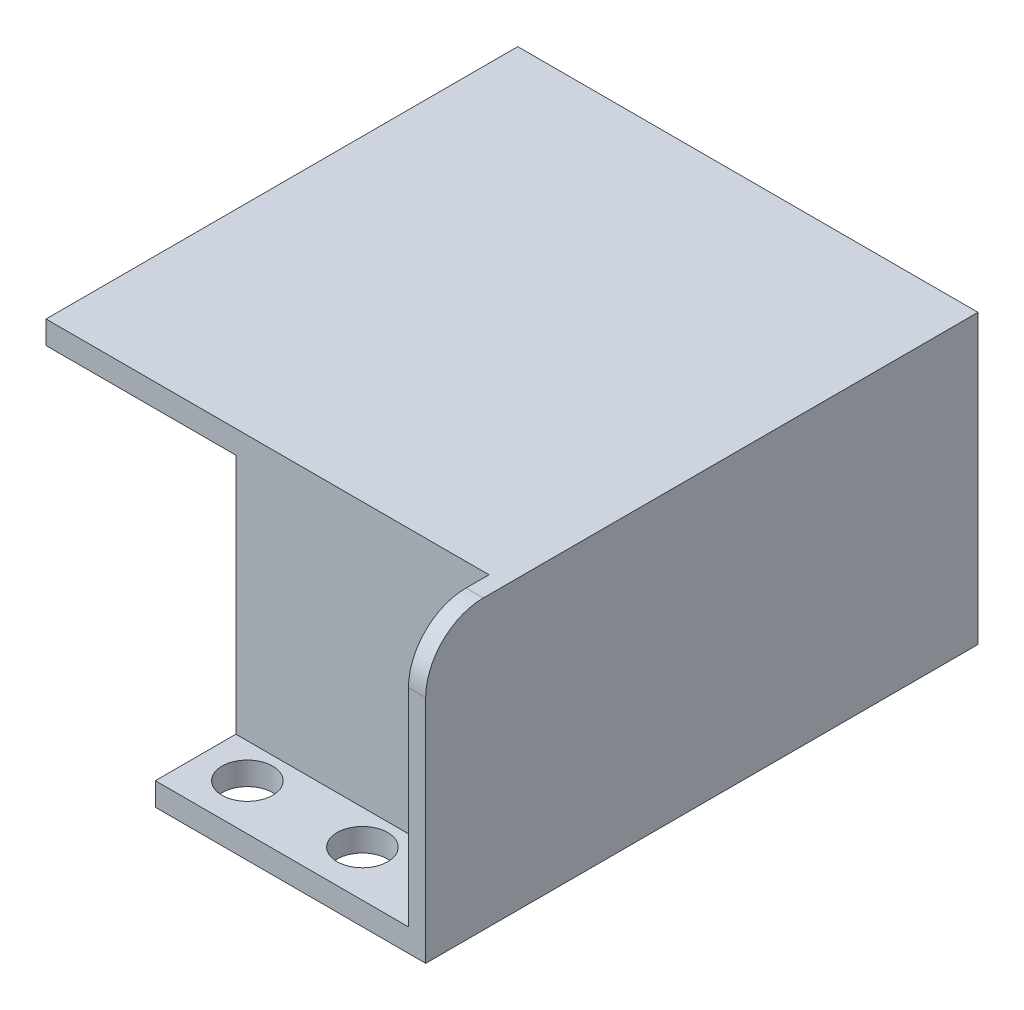
ISO-10303-21;
HEADER;
FILE_DESCRIPTION(('STEP AP214'),'2;1');
FILE_NAME('part.step','',(''),(''),'','','');
FILE_SCHEMA(('AUTOMOTIVE_DESIGN { 1 0 10303 214 1 1 1 1 }'));
ENDSEC;
DATA;
#1=APPLICATION_CONTEXT('core data for automotive mechanical design processes');
#2=APPLICATION_PROTOCOL_DEFINITION('international standard','automotive_design',2000,#1);
#3=PRODUCT_CONTEXT('',#1,'mechanical');
#4=PRODUCT('Part','Part','',(#3));
#5=PRODUCT_RELATED_PRODUCT_CATEGORY('part','',(#4));
#6=PRODUCT_DEFINITION_FORMATION('','',#4);
#7=PRODUCT_DEFINITION_CONTEXT('part definition',#1,'design');
#8=PRODUCT_DEFINITION('design','',#6,#7);
#9=PRODUCT_DEFINITION_SHAPE('','',#8);
#10=(LENGTH_UNIT() NAMED_UNIT(*) SI_UNIT(.MILLI.,.METRE.));
#11=(NAMED_UNIT(*) PLANE_ANGLE_UNIT() SI_UNIT($,.RADIAN.));
#12=(NAMED_UNIT(*) SI_UNIT($,.STERADIAN.) SOLID_ANGLE_UNIT());
#13=UNCERTAINTY_MEASURE_WITH_UNIT(LENGTH_MEASURE(1.E-05),#10,'distance_accuracy_value','');
#14=(GEOMETRIC_REPRESENTATION_CONTEXT(3) GLOBAL_UNCERTAINTY_ASSIGNED_CONTEXT((#13)) GLOBAL_UNIT_ASSIGNED_CONTEXT((#10,
#11,#12)) REPRESENTATION_CONTEXT('',''));
#15=CARTESIAN_POINT('',(0.,0.,0.));
#16=DIRECTION('',(0.,0.,1.));
#17=DIRECTION('',(1.,0.,0.));
#18=AXIS2_PLACEMENT_3D('',#15,#16,#17);
#19=CARTESIAN_POINT('',(22.,-23.,8.));
#20=DIRECTION('',(0.,0.,-1.));
#21=DIRECTION('',(-1.,0.,0.));
#22=AXIS2_PLACEMENT_3D('',#19,#20,#21);
#23=PLANE('',#22);
#24=DIRECTION('',(0.,-1.,0.));
#25=VECTOR('',#24,1.);
#26=CARTESIAN_POINT('',(23.5,-25.,8.));
#27=LINE('',#26,#25);
#28=CARTESIAN_POINT('',(23.5,-5.,8.));
#29=VERTEX_POINT('',#28);
#30=CARTESIAN_POINT('',(23.5,-25.,8.));
#31=VERTEX_POINT('',#30);
#32=EDGE_CURVE('E166',#29,#31,#27,.T.);
#33=ORIENTED_EDGE('',*,*,#32,.F.);
#34=DIRECTION('',(-1.,0.,0.));
#35=VECTOR('',#34,1.);
#36=CARTESIAN_POINT('',(22.,-5.,8.));
#37=LINE('',#36,#35);
#38=CARTESIAN_POINT('',(22.,-5.,8.));
#39=VERTEX_POINT('',#38);
#40=EDGE_CURVE('E186',#29,#39,#37,.T.);
#41=ORIENTED_EDGE('',*,*,#40,.T.);
#42=DIRECTION('',(0.,-1.,0.));
#43=VECTOR('',#42,1.);
#44=CARTESIAN_POINT('',(22.,-25.,8.));
#45=LINE('',#44,#43);
#46=CARTESIAN_POINT('',(22.,-23.,8.));
#47=VERTEX_POINT('',#46);
#48=EDGE_CURVE('E165',#39,#47,#45,.T.);
#49=ORIENTED_EDGE('',*,*,#48,.T.);
#50=DIRECTION('',(-1.,0.,0.));
#51=VECTOR('',#50,1.);
#52=CARTESIAN_POINT('',(22.,-23.,8.));
#53=LINE('',#52,#51);
#54=CARTESIAN_POINT('',(0.,-23.,8.));
#55=VERTEX_POINT('',#54);
#56=EDGE_CURVE('E206',#47,#55,#53,.T.);
#57=ORIENTED_EDGE('',*,*,#56,.T.);
#58=DIRECTION('',(0.,-1.,0.));
#59=VECTOR('',#58,1.);
#60=CARTESIAN_POINT('',(0.,-23.,8.));
#61=LINE('',#60,#59);
#62=CARTESIAN_POINT('',(0.,-25.,8.));
#63=VERTEX_POINT('',#62);
#64=EDGE_CURVE('E222',#55,#63,#61,.T.);
#65=ORIENTED_EDGE('',*,*,#64,.T.);
#66=DIRECTION('',(-1.,0.,0.));
#67=VECTOR('',#66,1.);
#68=CARTESIAN_POINT('',(22.,-25.,8.));
#69=LINE('',#68,#67);
#70=EDGE_CURVE('E189',#31,#63,#69,.T.);
#71=ORIENTED_EDGE('',*,*,#70,.F.);
#72=EDGE_LOOP('',(#33,#41,#49,#57,#65,#71));
#73=FACE_BOUND('',#72,.T.);
#74=ADVANCED_FACE('F35',(#73),#23,.F.);
#75=CARTESIAN_POINT('',(22.,-25.,8.));
#76=DIRECTION('',(0.,1.,0.));
#77=DIRECTION('',(0.,0.,1.));
#78=AXIS2_PLACEMENT_3D('',#75,#76,#77);
#79=PLANE('',#78);
#80=CARTESIAN_POINT('',(4.,-25.,4.));
#81=DIRECTION('',(0.,-1.,0.));
#82=DIRECTION('',(0.,0.,-1.));
#83=AXIS2_PLACEMENT_3D('',#80,#81,#82);
#84=CIRCLE('',#83,2.2);
#85=CARTESIAN_POINT('',(4.,-25.,1.8));
#86=VERTEX_POINT('',#85);
#87=EDGE_CURVE('E326',#86,#86,#84,.T.);
#88=ORIENTED_EDGE('',*,*,#87,.F.);
#89=EDGE_LOOP('',(#88));
#90=FACE_BOUND('',#89,.T.);
#91=CARTESIAN_POINT('',(14.,-25.,4.));
#92=DIRECTION('',(0.,-1.,0.));
#93=DIRECTION('',(0.,0.,-1.));
#94=AXIS2_PLACEMENT_3D('',#91,#92,#93);
#95=CIRCLE('',#94,2.2);
#96=CARTESIAN_POINT('',(14.,-25.,1.8));
#97=VERTEX_POINT('',#96);
#98=EDGE_CURVE('E317',#97,#97,#95,.T.);
#99=ORIENTED_EDGE('',*,*,#98,.F.);
#100=EDGE_LOOP('',(#99));
#101=FACE_BOUND('',#100,.T.);
#102=DIRECTION('',(0.,0.,-1.));
#103=VECTOR('',#102,1.);
#104=CARTESIAN_POINT('',(0.,-25.,8.));
#105=LINE('',#104,#103);
#106=CARTESIAN_POINT('',(0.,-25.,0.));
#107=VERTEX_POINT('',#106);
#108=EDGE_CURVE('E224',#63,#107,#105,.T.);
#109=ORIENTED_EDGE('',*,*,#108,.T.);
#110=DIRECTION('',(-1.,0.,0.));
#111=VECTOR('',#110,1.);
#112=CARTESIAN_POINT('',(22.,-25.,0.));
#113=LINE('',#112,#111);
#114=CARTESIAN_POINT('',(22.,-25.,0.));
#115=VERTEX_POINT('',#114);
#116=EDGE_CURVE('E194',#115,#107,#113,.T.);
#117=ORIENTED_EDGE('',*,*,#116,.F.);
#118=DIRECTION('',(0.,0.,-1.));
#119=VECTOR('',#118,1.);
#120=CARTESIAN_POINT('',(22.,-25.,8.));
#121=LINE('',#120,#119);
#122=CARTESIAN_POINT('',(22.,-25.,-40.));
#123=VERTEX_POINT('',#122);
#124=EDGE_CURVE('E183',#115,#123,#121,.T.);
#125=ORIENTED_EDGE('',*,*,#124,.T.);
#126=DIRECTION('',(-1.,0.,0.));
#127=VECTOR('',#126,1.);
#128=CARTESIAN_POINT('',(23.5,-25.,-40.));
#129=LINE('',#128,#127);
#130=CARTESIAN_POINT('',(23.5,-25.,-40.));
#131=VERTEX_POINT('',#130);
#132=EDGE_CURVE('E225',#131,#123,#129,.T.);
#133=ORIENTED_EDGE('',*,*,#132,.F.);
#134=DIRECTION('',(0.,0.,-1.));
#135=VECTOR('',#134,1.);
#136=CARTESIAN_POINT('',(23.5,-25.,8.));
#137=LINE('',#136,#135);
#138=EDGE_CURVE('E168',#31,#131,#137,.T.);
#139=ORIENTED_EDGE('',*,*,#138,.F.);
#140=ORIENTED_EDGE('',*,*,#70,.T.);
#141=EDGE_LOOP('',(#109,#117,#125,#133,#139,#140));
#142=FACE_BOUND('',#141,.T.);
#143=ADVANCED_FACE('F258',(#90,#101,#142),#79,.F.);
#144=CARTESIAN_POINT('',(22.,-25.,0.));
#145=DIRECTION('',(0.,0.,1.));
#146=DIRECTION('',(1.,0.,0.));
#147=AXIS2_PLACEMENT_3D('',#144,#145,#146);
#148=PLANE('',#147);
#149=DIRECTION('',(0.,1.,0.));
#150=VECTOR('',#149,1.);
#151=CARTESIAN_POINT('',(0.,-25.,0.));
#152=LINE('',#151,#150);
#153=CARTESIAN_POINT('',(0.,-2.,0.));
#154=VERTEX_POINT('',#153);
#155=EDGE_CURVE('E227',#107,#154,#152,.T.);
#156=ORIENTED_EDGE('',*,*,#155,.T.);
#157=DIRECTION('',(1.,0.,0.));
#158=VECTOR('',#157,1.);
#159=CARTESIAN_POINT('',(22.,-2.,0.));
#160=LINE('',#159,#158);
#161=CARTESIAN_POINT('',(22.,-2.,0.));
#162=VERTEX_POINT('',#161);
#163=EDGE_CURVE('E159',#154,#162,#160,.T.);
#164=ORIENTED_EDGE('',*,*,#163,.T.);
#165=DIRECTION('',(0.,1.,0.));
#166=VECTOR('',#165,1.);
#167=CARTESIAN_POINT('',(22.,-25.,0.));
#168=LINE('',#167,#166);
#169=EDGE_CURVE('E232',#115,#162,#168,.T.);
#170=ORIENTED_EDGE('',*,*,#169,.F.);
#171=ORIENTED_EDGE('',*,*,#116,.T.);
#172=EDGE_LOOP('',(#156,#164,#170,#171));
#173=FACE_BOUND('',#172,.T.);
#174=ADVANCED_FACE('F260',(#173),#148,.F.);
#175=CARTESIAN_POINT('',(22.,0.,1.));
#176=DIRECTION('',(0.,-1.,0.));
#177=DIRECTION('',(0.,0.,-1.));
#178=AXIS2_PLACEMENT_3D('',#175,#176,#177);
#179=PLANE('',#178);
#180=DIRECTION('',(0.,0.,1.));
#181=VECTOR('',#180,1.);
#182=CARTESIAN_POINT('',(22.,0.,8.));
#183=LINE('',#182,#181);
#184=CARTESIAN_POINT('',(22.,0.,1.));
#185=VERTEX_POINT('',#184);
#186=CARTESIAN_POINT('',(22.,0.,3.));
#187=VERTEX_POINT('',#186);
#188=EDGE_CURVE('E169',#185,#187,#183,.T.);
#189=ORIENTED_EDGE('',*,*,#188,.T.);
#190=DIRECTION('',(-1.,0.,0.));
#191=VECTOR('',#190,1.);
#192=CARTESIAN_POINT('',(22.,0.,3.));
#193=LINE('',#192,#191);
#194=CARTESIAN_POINT('',(23.5,0.,3.));
#195=VERTEX_POINT('',#194);
#196=EDGE_CURVE('E43',#187,#195,#193,.F.);
#197=ORIENTED_EDGE('',*,*,#196,.T.);
#198=DIRECTION('',(0.,0.,1.));
#199=VECTOR('',#198,1.);
#200=CARTESIAN_POINT('',(23.5,0.,8.));
#201=LINE('',#200,#199);
#202=CARTESIAN_POINT('',(23.5,0.,-40.));
#203=VERTEX_POINT('',#202);
#204=EDGE_CURVE('E173',#203,#195,#201,.T.);
#205=ORIENTED_EDGE('',*,*,#204,.F.);
#206=DIRECTION('',(-1.,0.,0.));
#207=VECTOR('',#206,1.);
#208=CARTESIAN_POINT('',(23.5,0.,-40.));
#209=LINE('',#208,#207);
#210=CARTESIAN_POINT('',(-16.5,0.,-40.));
#211=VERTEX_POINT('',#210);
#212=EDGE_CURVE('E175',#203,#211,#209,.T.);
#213=ORIENTED_EDGE('',*,*,#212,.T.);
#214=DIRECTION('',(0.,0.,1.));
#215=VECTOR('',#214,1.);
#216=CARTESIAN_POINT('',(-16.5,0.,-40.));
#217=LINE('',#216,#215);
#218=CARTESIAN_POINT('',(-16.5,0.,1.));
#219=VERTEX_POINT('',#218);
#220=EDGE_CURVE('E137',#211,#219,#217,.T.);
#221=ORIENTED_EDGE('',*,*,#220,.T.);
#222=DIRECTION('',(-1.,0.,0.));
#223=VECTOR('',#222,1.);
#224=CARTESIAN_POINT('',(22.,0.,1.));
#225=LINE('',#224,#223);
#226=EDGE_CURVE('E201',#185,#219,#225,.T.);
#227=ORIENTED_EDGE('',*,*,#226,.F.);
#228=EDGE_LOOP('',(#189,#197,#205,#213,#221,#227));
#229=FACE_BOUND('',#228,.T.);
#230=ADVANCED_FACE('F290',(#229),#179,.F.);
#231=CARTESIAN_POINT('',(22.,0.,1.));
#232=DIRECTION('',(0.,0.,-1.));
#233=DIRECTION('',(0.,1.,0.));
#234=AXIS2_PLACEMENT_3D('',#231,#232,#233);
#235=PLANE('',#234);
#236=DIRECTION('',(-1.,0.,0.));
#237=VECTOR('',#236,1.);
#238=CARTESIAN_POINT('',(22.,-23.,0.999999999999997));
#239=LINE('',#238,#237);
#240=CARTESIAN_POINT('',(22.,-23.,0.999999999999997));
#241=VERTEX_POINT('',#240);
#242=CARTESIAN_POINT('',(0.,-23.,0.999999999999997));
#243=VERTEX_POINT('',#242);
#244=EDGE_CURVE('E204',#241,#243,#239,.T.);
#245=ORIENTED_EDGE('',*,*,#244,.F.);
#246=DIRECTION('',(0.,-1.,0.));
#247=VECTOR('',#246,1.);
#248=CARTESIAN_POINT('',(22.,0.,1.));
#249=LINE('',#248,#247);
#250=EDGE_CURVE('E215',#185,#241,#249,.T.);
#251=ORIENTED_EDGE('',*,*,#250,.F.);
#252=ORIENTED_EDGE('',*,*,#226,.T.);
#253=DIRECTION('',(0.,1.,0.));
#254=VECTOR('',#253,1.);
#255=CARTESIAN_POINT('',(-16.5,-2.,1.));
#256=LINE('',#255,#254);
#257=CARTESIAN_POINT('',(-16.5,-2.,1.));
#258=VERTEX_POINT('',#257);
#259=EDGE_CURVE('E145',#258,#219,#256,.T.);
#260=ORIENTED_EDGE('',*,*,#259,.F.);
#261=DIRECTION('',(1.,0.,0.));
#262=VECTOR('',#261,1.);
#263=CARTESIAN_POINT('',(23.5,-2.,1.));
#264=LINE('',#263,#262);
#265=CARTESIAN_POINT('',(0.,-2.,1.));
#266=VERTEX_POINT('',#265);
#267=EDGE_CURVE('E146',#258,#266,#264,.T.);
#268=ORIENTED_EDGE('',*,*,#267,.T.);
#269=DIRECTION('',(0.,-1.,0.));
#270=VECTOR('',#269,1.);
#271=CARTESIAN_POINT('',(0.,0.,1.));
#272=LINE('',#271,#270);
#273=EDGE_CURVE('E230',#266,#243,#272,.T.);
#274=ORIENTED_EDGE('',*,*,#273,.T.);
#275=EDGE_LOOP('',(#245,#251,#252,#260,#268,#274));
#276=FACE_BOUND('',#275,.T.);
#277=ADVANCED_FACE('F251',(#276),#235,.F.);
#278=CARTESIAN_POINT('',(22.,-23.,0.999999999999997));
#279=DIRECTION('',(0.,-1.,0.));
#280=DIRECTION('',(0.,0.,-1.));
#281=AXIS2_PLACEMENT_3D('',#278,#279,#280);
#282=PLANE('',#281);
#283=CARTESIAN_POINT('',(4.,-23.,4.));
#284=DIRECTION('',(0.,-1.,0.));
#285=DIRECTION('',(0.,0.,-1.));
#286=AXIS2_PLACEMENT_3D('',#283,#284,#285);
#287=CIRCLE('',#286,2.2);
#288=CARTESIAN_POINT('',(4.,-23.,1.8));
#289=VERTEX_POINT('',#288);
#290=EDGE_CURVE('E321',#289,#289,#287,.F.);
#291=ORIENTED_EDGE('',*,*,#290,.F.);
#292=EDGE_LOOP('',(#291));
#293=FACE_BOUND('',#292,.T.);
#294=CARTESIAN_POINT('',(14.,-23.,4.));
#295=DIRECTION('',(0.,-1.,0.));
#296=DIRECTION('',(0.,0.,-1.));
#297=AXIS2_PLACEMENT_3D('',#294,#295,#296);
#298=CIRCLE('',#297,2.2);
#299=CARTESIAN_POINT('',(14.,-23.,1.8));
#300=VERTEX_POINT('',#299);
#301=EDGE_CURVE('E155',#300,#300,#298,.F.);
#302=ORIENTED_EDGE('',*,*,#301,.F.);
#303=EDGE_LOOP('',(#302));
#304=FACE_BOUND('',#303,.T.);
#305=DIRECTION('',(0.,0.,1.));
#306=VECTOR('',#305,1.);
#307=CARTESIAN_POINT('',(0.,-23.,0.999999999999997));
#308=LINE('',#307,#306);
#309=EDGE_CURVE('E231',#243,#55,#308,.T.);
#310=ORIENTED_EDGE('',*,*,#309,.T.);
#311=ORIENTED_EDGE('',*,*,#56,.F.);
#312=DIRECTION('',(0.,0.,1.));
#313=VECTOR('',#312,1.);
#314=CARTESIAN_POINT('',(22.,-23.,0.999999999999997));
#315=LINE('',#314,#313);
#316=EDGE_CURVE('E209',#241,#47,#315,.T.);
#317=ORIENTED_EDGE('',*,*,#316,.F.);
#318=ORIENTED_EDGE('',*,*,#244,.T.);
#319=EDGE_LOOP('',(#310,#311,#317,#318));
#320=FACE_BOUND('',#319,.T.);
#321=ADVANCED_FACE('F253',(#293,#304,#320),#282,.F.);
#322=CARTESIAN_POINT('',(0.,0.,0.));
#323=DIRECTION('',(1.,0.,0.));
#324=DIRECTION('',(0.,0.,-1.));
#325=AXIS2_PLACEMENT_3D('',#322,#323,#324);
#326=PLANE('',#325);
#327=ORIENTED_EDGE('',*,*,#273,.F.);
#328=DIRECTION('',(0.,0.,-1.));
#329=VECTOR('',#328,1.);
#330=CARTESIAN_POINT('',(0.,-2.,0.));
#331=LINE('',#330,#329);
#332=EDGE_CURVE('E162',#266,#154,#331,.T.);
#333=ORIENTED_EDGE('',*,*,#332,.T.);
#334=ORIENTED_EDGE('',*,*,#155,.F.);
#335=ORIENTED_EDGE('',*,*,#108,.F.);
#336=ORIENTED_EDGE('',*,*,#64,.F.);
#337=ORIENTED_EDGE('',*,*,#309,.F.);
#338=EDGE_LOOP('',(#327,#333,#334,#335,#336,#337));
#339=FACE_BOUND('',#338,.T.);
#340=ADVANCED_FACE('F256',(#339),#326,.F.);
#341=CARTESIAN_POINT('',(22.,0.,0.));
#342=DIRECTION('',(-1.,0.,0.));
#343=DIRECTION('',(0.,0.,1.));
#344=AXIS2_PLACEMENT_3D('',#341,#342,#343);
#345=PLANE('',#344);
#346=DIRECTION('',(0.,0.,1.));
#347=VECTOR('',#346,1.);
#348=CARTESIAN_POINT('',(22.,-2.,0.));
#349=LINE('',#348,#347);
#350=CARTESIAN_POINT('',(22.,-2.,-40.));
#351=VERTEX_POINT('',#350);
#352=EDGE_CURVE('E156',#351,#162,#349,.T.);
#353=ORIENTED_EDGE('',*,*,#352,.F.);
#354=DIRECTION('',(0.,1.,0.));
#355=VECTOR('',#354,1.);
#356=CARTESIAN_POINT('',(22.,-25.,-40.));
#357=LINE('',#356,#355);
#358=EDGE_CURVE('E132',#123,#351,#357,.T.);
#359=ORIENTED_EDGE('',*,*,#358,.F.);
#360=ORIENTED_EDGE('',*,*,#124,.F.);
#361=ORIENTED_EDGE('',*,*,#169,.T.);
#362=EDGE_LOOP('',(#353,#359,#360,#361));
#363=FACE_BOUND('',#362,.T.);
#364=ADVANCED_FACE('F261',(#363),#345,.T.);
#365=CARTESIAN_POINT('',(23.5,-25.,-40.));
#366=DIRECTION('',(0.,0.,1.));
#367=DIRECTION('',(1.,0.,0.));
#368=AXIS2_PLACEMENT_3D('',#365,#366,#367);
#369=PLANE('',#368);
#370=ORIENTED_EDGE('',*,*,#358,.T.);
#371=DIRECTION('',(-1.,0.,0.));
#372=VECTOR('',#371,1.);
#373=CARTESIAN_POINT('',(23.5,-2.,-40.));
#374=LINE('',#373,#372);
#375=CARTESIAN_POINT('',(-16.5,-2.,-40.));
#376=VERTEX_POINT('',#375);
#377=EDGE_CURVE('E124',#351,#376,#374,.T.);
#378=ORIENTED_EDGE('',*,*,#377,.T.);
#379=DIRECTION('',(0.,1.,0.));
#380=VECTOR('',#379,1.);
#381=CARTESIAN_POINT('',(-16.5,-2.,-40.));
#382=LINE('',#381,#380);
#383=EDGE_CURVE('E128',#376,#211,#382,.T.);
#384=ORIENTED_EDGE('',*,*,#383,.T.);
#385=ORIENTED_EDGE('',*,*,#212,.F.);
#386=DIRECTION('',(0.,1.,0.));
#387=VECTOR('',#386,1.);
#388=CARTESIAN_POINT('',(23.5,-25.,-40.));
#389=LINE('',#388,#387);
#390=EDGE_CURVE('E171',#131,#203,#389,.T.);
#391=ORIENTED_EDGE('',*,*,#390,.F.);
#392=ORIENTED_EDGE('',*,*,#132,.T.);
#393=EDGE_LOOP('',(#370,#378,#384,#385,#391,#392));
#394=FACE_BOUND('',#393,.T.);
#395=ADVANCED_FACE('F126',(#394),#369,.F.);
#396=CARTESIAN_POINT('',(23.5,0.,0.));
#397=DIRECTION('',(-1.,0.,0.));
#398=DIRECTION('',(0.,0.,1.));
#399=AXIS2_PLACEMENT_3D('',#396,#397,#398);
#400=PLANE('',#399);
#401=ORIENTED_EDGE('',*,*,#204,.T.);
#402=CARTESIAN_POINT('',(23.5,-5.,3.));
#403=DIRECTION('',(-1.,0.,0.));
#404=DIRECTION('',(0.,0.,1.));
#405=AXIS2_PLACEMENT_3D('',#402,#403,#404);
#406=CIRCLE('',#405,5.);
#407=EDGE_CURVE('E11',#195,#29,#406,.F.);
#408=ORIENTED_EDGE('',*,*,#407,.T.);
#409=ORIENTED_EDGE('',*,*,#32,.T.);
#410=ORIENTED_EDGE('',*,*,#138,.T.);
#411=ORIENTED_EDGE('',*,*,#390,.T.);
#412=EDGE_LOOP('',(#401,#408,#409,#410,#411));
#413=FACE_BOUND('',#412,.T.);
#414=ADVANCED_FACE('F270',(#413),#400,.F.);
#415=ORIENTED_EDGE('',*,*,#48,.F.);
#416=CARTESIAN_POINT('',(22.,-5.,3.));
#417=DIRECTION('',(-1.,0.,0.));
#418=DIRECTION('',(0.,0.,1.));
#419=AXIS2_PLACEMENT_3D('',#416,#417,#418);
#420=CIRCLE('',#419,5.);
#421=EDGE_CURVE('E57',#39,#187,#420,.T.);
#422=ORIENTED_EDGE('',*,*,#421,.T.);
#423=ORIENTED_EDGE('',*,*,#188,.F.);
#424=ORIENTED_EDGE('',*,*,#250,.T.);
#425=ORIENTED_EDGE('',*,*,#316,.T.);
#426=EDGE_LOOP('',(#415,#422,#423,#424,#425));
#427=FACE_BOUND('',#426,.T.);
#428=ADVANCED_FACE('F248',(#427),#345,.T.);
#429=CARTESIAN_POINT('',(0.,-2.,0.));
#430=DIRECTION('',(0.,-1.,0.));
#431=DIRECTION('',(0.,0.,-1.));
#432=AXIS2_PLACEMENT_3D('',#429,#430,#431);
#433=PLANE('',#432);
#434=ORIENTED_EDGE('',*,*,#332,.F.);
#435=ORIENTED_EDGE('',*,*,#267,.F.);
#436=DIRECTION('',(0.,0.,1.));
#437=VECTOR('',#436,1.);
#438=CARTESIAN_POINT('',(-16.5,-2.,-40.));
#439=LINE('',#438,#437);
#440=EDGE_CURVE('E136',#376,#258,#439,.T.);
#441=ORIENTED_EDGE('',*,*,#440,.F.);
#442=ORIENTED_EDGE('',*,*,#377,.F.);
#443=ORIENTED_EDGE('',*,*,#352,.T.);
#444=ORIENTED_EDGE('',*,*,#163,.F.);
#445=EDGE_LOOP('',(#434,#435,#441,#442,#443,#444));
#446=FACE_BOUND('',#445,.T.);
#447=ADVANCED_FACE('F148',(#446),#433,.T.);
#448=CARTESIAN_POINT('',(-16.5,-2.,-40.));
#449=DIRECTION('',(-1.,0.,0.));
#450=DIRECTION('',(0.,0.,1.));
#451=AXIS2_PLACEMENT_3D('',#448,#449,#450);
#452=PLANE('',#451);
#453=ORIENTED_EDGE('',*,*,#220,.F.);
#454=ORIENTED_EDGE('',*,*,#383,.F.);
#455=ORIENTED_EDGE('',*,*,#440,.T.);
#456=ORIENTED_EDGE('',*,*,#259,.T.);
#457=EDGE_LOOP('',(#453,#454,#455,#456));
#458=FACE_BOUND('',#457,.T.);
#459=ADVANCED_FACE('F141',(#458),#452,.T.);
#460=CARTESIAN_POINT('',(14.,0.00104999999999897,4.));
#461=DIRECTION('',(0.,-1.,0.));
#462=DIRECTION('',(0.,0.,-1.));
#463=AXIS2_PLACEMENT_3D('',#460,#461,#462);
#464=CYLINDRICAL_SURFACE('',#463,2.2);
#465=ORIENTED_EDGE('',*,*,#98,.T.);
#466=EDGE_LOOP('',(#465));
#467=FACE_BOUND('',#466,.T.);
#468=ORIENTED_EDGE('',*,*,#301,.T.);
#469=EDGE_LOOP('',(#468));
#470=FACE_BOUND('',#469,.T.);
#471=ADVANCED_FACE('F278',(#467,#470),#464,.F.);
#472=CARTESIAN_POINT('',(4.,0.00104999999999897,4.));
#473=DIRECTION('',(0.,-1.,0.));
#474=DIRECTION('',(0.,0.,-1.));
#475=AXIS2_PLACEMENT_3D('',#472,#473,#474);
#476=CYLINDRICAL_SURFACE('',#475,2.2);
#477=ORIENTED_EDGE('',*,*,#87,.T.);
#478=EDGE_LOOP('',(#477));
#479=FACE_BOUND('',#478,.T.);
#480=ORIENTED_EDGE('',*,*,#290,.T.);
#481=EDGE_LOOP('',(#480));
#482=FACE_BOUND('',#481,.T.);
#483=ADVANCED_FACE('F274',(#479,#482),#476,.F.);
#484=CARTESIAN_POINT('',(22.,-5.,3.));
#485=DIRECTION('',(-1.,0.,0.));
#486=DIRECTION('',(0.,0.,1.));
#487=AXIS2_PLACEMENT_3D('',#484,#485,#486);
#488=CYLINDRICAL_SURFACE('',#487,5.);
#489=ORIENTED_EDGE('',*,*,#407,.F.);
#490=ORIENTED_EDGE('',*,*,#196,.F.);
#491=ORIENTED_EDGE('',*,*,#421,.F.);
#492=ORIENTED_EDGE('',*,*,#40,.F.);
#493=EDGE_LOOP('',(#489,#490,#491,#492));
#494=FACE_BOUND('',#493,.T.);
#495=ADVANCED_FACE('F37',(#494),#488,.T.);
#496=CLOSED_SHELL('',(#74,#143,#174,#230,#277,#321,#340,#364,#395,#414,#428,#447,#459,#471,#483,#495));
#497=MANIFOLD_SOLID_BREP('B2',#496);
#498=ADVANCED_BREP_SHAPE_REPRESENTATION('',(#18,#497),#14);
#499=SHAPE_DEFINITION_REPRESENTATION(#9,#498);
ENDSEC;
END-ISO-10303-21;
